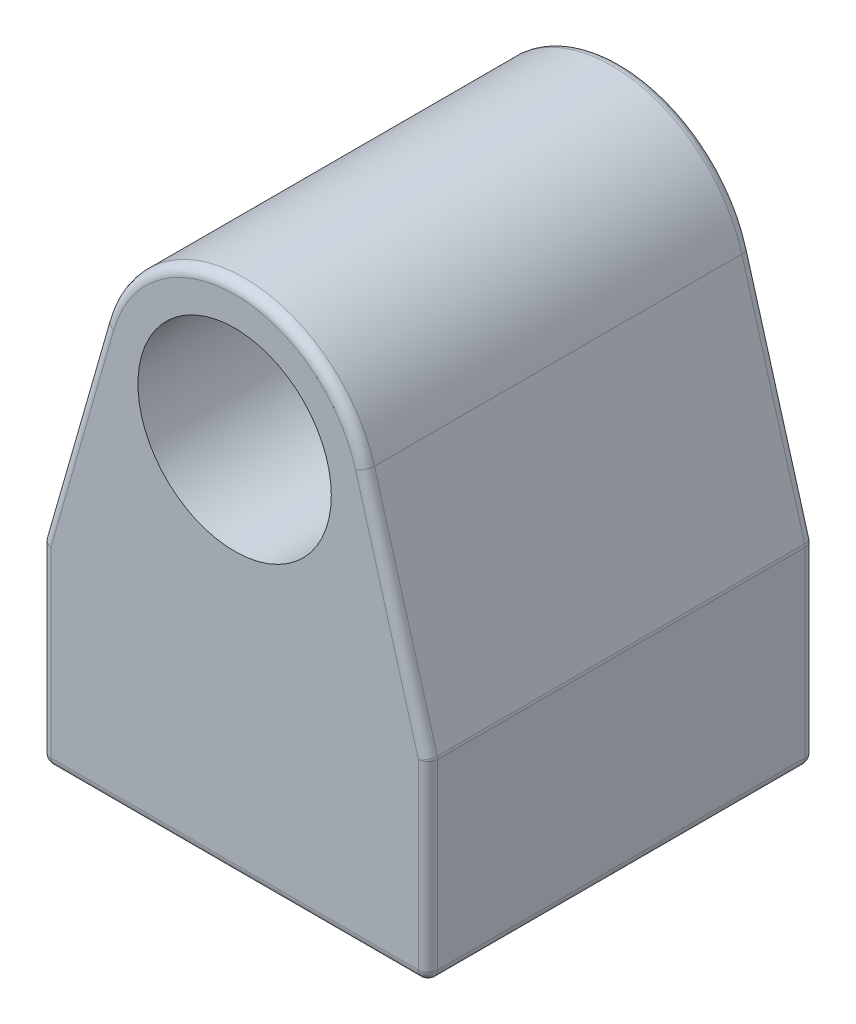
ISO-10303-21;
HEADER;
FILE_DESCRIPTION(('STEP AP214'),'2;1');
FILE_NAME('part.step','',(''),(''),'','','');
FILE_SCHEMA(('AUTOMOTIVE_DESIGN { 1 0 10303 214 1 1 1 1 }'));
ENDSEC;
DATA;
#1=APPLICATION_CONTEXT('core data for automotive mechanical design processes');
#2=APPLICATION_PROTOCOL_DEFINITION('international standard','automotive_design',2000,#1);
#3=PRODUCT_CONTEXT('',#1,'mechanical');
#4=PRODUCT('Part','Part','',(#3));
#5=PRODUCT_RELATED_PRODUCT_CATEGORY('part','',(#4));
#6=PRODUCT_DEFINITION_FORMATION('','',#4);
#7=PRODUCT_DEFINITION_CONTEXT('part definition',#1,'design');
#8=PRODUCT_DEFINITION('design','',#6,#7);
#9=PRODUCT_DEFINITION_SHAPE('','',#8);
#10=(LENGTH_UNIT() NAMED_UNIT(*) SI_UNIT(.MILLI.,.METRE.));
#11=(NAMED_UNIT(*) PLANE_ANGLE_UNIT() SI_UNIT($,.RADIAN.));
#12=(NAMED_UNIT(*) SI_UNIT($,.STERADIAN.) SOLID_ANGLE_UNIT());
#13=UNCERTAINTY_MEASURE_WITH_UNIT(LENGTH_MEASURE(1.E-05),#10,'distance_accuracy_value','');
#14=(GEOMETRIC_REPRESENTATION_CONTEXT(3) GLOBAL_UNCERTAINTY_ASSIGNED_CONTEXT((#13)) GLOBAL_UNIT_ASSIGNED_CONTEXT((#10,
#11,#12)) REPRESENTATION_CONTEXT('',''));
#15=CARTESIAN_POINT('',(0.,0.,0.));
#16=DIRECTION('',(0.,0.,1.));
#17=DIRECTION('',(1.,0.,0.));
#18=AXIS2_PLACEMENT_3D('',#15,#16,#17);
#19=CARTESIAN_POINT('',(0.,14.5,20.));
#20=DIRECTION('',(0.,0.,1.));
#21=DIRECTION('',(1.,0.,0.));
#22=AXIS2_PLACEMENT_3D('',#19,#20,#21);
#23=PLANE('',#22);
#24=DIRECTION('',(-0.275157126097487,0.961399269792614,0.));
#25=VECTOR('',#24,1.);
#26=CARTESIAN_POINT('',(6.24909525365199,16.2885213196337,20.));
#27=LINE('',#26,#25);
#28=CARTESIAN_POINT('',(9.49999999999999,4.92985693164692,20.));
#29=VERTEX_POINT('',#28);
#30=CARTESIAN_POINT('',(6.24909525365199,16.2885213196337,20.));
#31=VERTEX_POINT('',#30);
#32=EDGE_CURVE('E179',#29,#31,#27,.T.);
#33=ORIENTED_EDGE('',*,*,#32,.T.);
#34=CARTESIAN_POINT('',(0.,14.5,20.));
#35=DIRECTION('',(0.,0.,1.));
#36=DIRECTION('',(1.,0.,0.));
#37=AXIS2_PLACEMENT_3D('',#34,#35,#36);
#38=CIRCLE('',#37,6.5);
#39=CARTESIAN_POINT('',(-6.24909525365199,16.2885213196337,20.));
#40=VERTEX_POINT('',#39);
#41=EDGE_CURVE('E158',#31,#40,#38,.T.);
#42=ORIENTED_EDGE('',*,*,#41,.T.);
#43=DIRECTION('',(-0.27515712609749,-0.961399269792613,0.));
#44=VECTOR('',#43,1.);
#45=CARTESIAN_POINT('',(-9.5193003651037,4.86242143695125,20.));
#46=LINE('',#45,#44);
#47=CARTESIAN_POINT('',(-9.50000000000001,4.92985693164692,20.));
#48=VERTEX_POINT('',#47);
#49=EDGE_CURVE('E167',#40,#48,#46,.T.);
#50=ORIENTED_EDGE('',*,*,#49,.T.);
#51=DIRECTION('',(0.,-1.,0.));
#52=VECTOR('',#51,1.);
#53=CARTESIAN_POINT('',(-9.50000000000001,-5.00000000000001,20.));
#54=LINE('',#53,#52);
#55=CARTESIAN_POINT('',(-9.50000000000001,-4.5,20.));
#56=VERTEX_POINT('',#55);
#57=EDGE_CURVE('E174',#48,#56,#54,.T.);
#58=ORIENTED_EDGE('',*,*,#57,.T.);
#59=DIRECTION('',(1.,0.,0.));
#60=VECTOR('',#59,1.);
#61=CARTESIAN_POINT('',(9.99999999999999,-4.5,20.));
#62=LINE('',#61,#60);
#63=CARTESIAN_POINT('',(9.49999999999999,-4.5,20.));
#64=VERTEX_POINT('',#63);
#65=EDGE_CURVE('E388',#56,#64,#62,.T.);
#66=ORIENTED_EDGE('',*,*,#65,.T.);
#67=DIRECTION('',(0.,1.,0.));
#68=VECTOR('',#67,1.);
#69=CARTESIAN_POINT('',(9.49999999999999,5.,20.));
#70=LINE('',#69,#68);
#71=EDGE_CURVE('E187',#64,#29,#70,.T.);
#72=ORIENTED_EDGE('',*,*,#71,.T.);
#73=EDGE_LOOP('',(#33,#42,#50,#58,#66,#72));
#74=FACE_BOUND('',#73,.T.);
#75=CARTESIAN_POINT('',(0.,14.5,20.));
#76=DIRECTION('',(0.,0.,1.));
#77=DIRECTION('',(1.,0.,0.));
#78=AXIS2_PLACEMENT_3D('',#75,#76,#77);
#79=CIRCLE('',#78,5.);
#80=CARTESIAN_POINT('',(5.,14.5,20.));
#81=VERTEX_POINT('',#80);
#82=EDGE_CURVE('E372',#81,#81,#79,.T.);
#83=ORIENTED_EDGE('',*,*,#82,.F.);
#84=EDGE_LOOP('',(#83));
#85=FACE_BOUND('',#84,.T.);
#86=ADVANCED_FACE('F39',(#74,#85),#23,.T.);
#87=CARTESIAN_POINT('',(0.,14.5,0.));
#88=DIRECTION('',(0.,0.,1.));
#89=DIRECTION('',(1.,0.,0.));
#90=AXIS2_PLACEMENT_3D('',#87,#88,#89);
#91=PLANE('',#90);
#92=DIRECTION('',(-0.27515712609749,-0.961399269792613,0.));
#93=VECTOR('',#92,1.);
#94=CARTESIAN_POINT('',(-6.24909525365198,16.2885213196337,0.));
#95=LINE('',#94,#93);
#96=CARTESIAN_POINT('',(-9.50000000000001,4.92985693164692,0.));
#97=VERTEX_POINT('',#96);
#98=CARTESIAN_POINT('',(-6.24909525365199,16.2885213196337,0.));
#99=VERTEX_POINT('',#98);
#100=EDGE_CURVE('E193',#97,#99,#95,.F.);
#101=ORIENTED_EDGE('',*,*,#100,.T.);
#102=CARTESIAN_POINT('',(0.,14.5,0.));
#103=DIRECTION('',(0.,0.,1.));
#104=DIRECTION('',(1.,0.,0.));
#105=AXIS2_PLACEMENT_3D('',#102,#103,#104);
#106=CIRCLE('',#105,6.5);
#107=CARTESIAN_POINT('',(6.24909525365199,16.2885213196337,0.));
#108=VERTEX_POINT('',#107);
#109=EDGE_CURVE('E208',#99,#108,#106,.F.);
#110=ORIENTED_EDGE('',*,*,#109,.T.);
#111=DIRECTION('',(-0.275157126097487,0.961399269792614,0.));
#112=VECTOR('',#111,1.);
#113=CARTESIAN_POINT('',(6.24909525365199,16.2885213196337,0.));
#114=LINE('',#113,#112);
#115=CARTESIAN_POINT('',(9.49999999999999,4.92985693164692,0.));
#116=VERTEX_POINT('',#115);
#117=EDGE_CURVE('E205',#108,#116,#114,.F.);
#118=ORIENTED_EDGE('',*,*,#117,.T.);
#119=DIRECTION('',(0.,1.,0.));
#120=VECTOR('',#119,1.);
#121=CARTESIAN_POINT('',(9.49999999999999,14.5,0.));
#122=LINE('',#121,#120);
#123=CARTESIAN_POINT('',(9.49999999999999,-4.5,0.));
#124=VERTEX_POINT('',#123);
#125=EDGE_CURVE('E202',#116,#124,#122,.F.);
#126=ORIENTED_EDGE('',*,*,#125,.T.);
#127=DIRECTION('',(1.,0.,0.));
#128=VECTOR('',#127,1.);
#129=CARTESIAN_POINT('',(0.,-4.5,0.));
#130=LINE('',#129,#128);
#131=CARTESIAN_POINT('',(-9.50000000000001,-4.5,0.));
#132=VERTEX_POINT('',#131);
#133=EDGE_CURVE('E199',#124,#132,#130,.F.);
#134=ORIENTED_EDGE('',*,*,#133,.T.);
#135=DIRECTION('',(0.,-1.,0.));
#136=VECTOR('',#135,1.);
#137=CARTESIAN_POINT('',(-9.50000000000001,14.5,0.));
#138=LINE('',#137,#136);
#139=EDGE_CURVE('E196',#132,#97,#138,.F.);
#140=ORIENTED_EDGE('',*,*,#139,.T.);
#141=EDGE_LOOP('',(#101,#110,#118,#126,#134,#140));
#142=FACE_BOUND('',#141,.T.);
#143=CARTESIAN_POINT('',(0.,14.5,0.));
#144=DIRECTION('',(0.,0.,1.));
#145=DIRECTION('',(1.,0.,0.));
#146=AXIS2_PLACEMENT_3D('',#143,#144,#145);
#147=CIRCLE('',#146,5.);
#148=CARTESIAN_POINT('',(5.,14.5,0.));
#149=VERTEX_POINT('',#148);
#150=EDGE_CURVE('E365',#149,#149,#147,.T.);
#151=ORIENTED_EDGE('',*,*,#150,.T.);
#152=EDGE_LOOP('',(#151));
#153=FACE_BOUND('',#152,.T.);
#154=ADVANCED_FACE('F434',(#142,#153),#91,.F.);
#155=CARTESIAN_POINT('',(9.99999999999999,5.,20.));
#156=DIRECTION('',(-1.,0.,0.));
#157=DIRECTION('',(0.,0.,1.));
#158=AXIS2_PLACEMENT_3D('',#155,#156,#157);
#159=PLANE('',#158);
#160=DIRECTION('',(0.,0.,-1.));
#161=VECTOR('',#160,1.);
#162=CARTESIAN_POINT('',(9.99999999999999,4.92985693164692,20.));
#163=LINE('',#162,#161);
#164=CARTESIAN_POINT('',(9.99999999999999,4.92985693164692,0.5));
#165=VERTEX_POINT('',#164);
#166=CARTESIAN_POINT('',(9.99999999999999,4.92985693164692,19.5));
#167=VERTEX_POINT('',#166);
#168=EDGE_CURVE('E227',#165,#167,#163,.F.);
#169=ORIENTED_EDGE('',*,*,#168,.T.);
#170=DIRECTION('',(0.,1.,0.));
#171=VECTOR('',#170,1.);
#172=CARTESIAN_POINT('',(9.99999999999999,-5.,19.5));
#173=LINE('',#172,#171);
#174=CARTESIAN_POINT('',(9.99999999999999,-4.5,19.5));
#175=VERTEX_POINT('',#174);
#176=EDGE_CURVE('E230',#167,#175,#173,.F.);
#177=ORIENTED_EDGE('',*,*,#176,.T.);
#178=DIRECTION('',(0.,0.,-1.));
#179=VECTOR('',#178,1.);
#180=CARTESIAN_POINT('',(9.99999999999999,-4.5,20.));
#181=LINE('',#180,#179);
#182=CARTESIAN_POINT('',(9.99999999999999,-4.5,0.5));
#183=VERTEX_POINT('',#182);
#184=EDGE_CURVE('E221',#175,#183,#181,.T.);
#185=ORIENTED_EDGE('',*,*,#184,.T.);
#186=DIRECTION('',(0.,1.,0.));
#187=VECTOR('',#186,1.);
#188=CARTESIAN_POINT('',(9.99999999999999,5.,0.5));
#189=LINE('',#188,#187);
#190=EDGE_CURVE('E224',#183,#165,#189,.T.);
#191=ORIENTED_EDGE('',*,*,#190,.T.);
#192=EDGE_LOOP('',(#169,#177,#185,#191));
#193=FACE_BOUND('',#192,.T.);
#194=ADVANCED_FACE('F426',(#193),#159,.F.);
#195=CARTESIAN_POINT('',(6.7297948885483,16.4260998826824,20.));
#196=DIRECTION('',(-0.961399269792614,-0.275157126097487,0.));
#197=DIRECTION('',(0.275157126097487,-0.961399269792614,0.));
#198=AXIS2_PLACEMENT_3D('',#195,#196,#197);
#199=PLANE('',#198);
#200=DIRECTION('',(0.,0.,-1.));
#201=VECTOR('',#200,1.);
#202=CARTESIAN_POINT('',(6.7297948885483,16.4260998826824,20.));
#203=LINE('',#202,#201);
#204=CARTESIAN_POINT('',(6.7297948885483,16.4260998826824,19.5));
#205=VERTEX_POINT('',#204);
#206=CARTESIAN_POINT('',(6.7297948885483,16.4260998826824,0.5));
#207=VERTEX_POINT('',#206);
#208=EDGE_CURVE('E175',#205,#207,#203,.T.);
#209=ORIENTED_EDGE('',*,*,#208,.F.);
#210=DIRECTION('',(-0.275157126097487,0.961399269792614,0.));
#211=VECTOR('',#210,1.);
#212=CARTESIAN_POINT('',(9.99999999999999,5.,19.5));
#213=LINE('',#212,#211);
#214=CARTESIAN_POINT('',(9.9806996348963,5.06743549469566,19.5));
#215=VERTEX_POINT('',#214);
#216=EDGE_CURVE('E218',#205,#215,#213,.F.);
#217=ORIENTED_EDGE('',*,*,#216,.T.);
#218=DIRECTION('',(0.,0.,-1.));
#219=VECTOR('',#218,1.);
#220=CARTESIAN_POINT('',(9.9806996348963,5.06743549469566,20.));
#221=LINE('',#220,#219);
#222=CARTESIAN_POINT('',(9.9806996348963,5.06743549469566,0.5));
#223=VERTEX_POINT('',#222);
#224=EDGE_CURVE('E212',#215,#223,#221,.T.);
#225=ORIENTED_EDGE('',*,*,#224,.T.);
#226=DIRECTION('',(-0.275157126097487,0.961399269792614,0.));
#227=VECTOR('',#226,1.);
#228=CARTESIAN_POINT('',(6.7297948885483,16.4260998826824,0.5));
#229=LINE('',#228,#227);
#230=EDGE_CURVE('E215',#223,#207,#229,.T.);
#231=ORIENTED_EDGE('',*,*,#230,.T.);
#232=EDGE_LOOP('',(#209,#217,#225,#231));
#233=FACE_BOUND('',#232,.T.);
#234=ADVANCED_FACE('F412',(#233),#199,.F.);
#235=CARTESIAN_POINT('',(0.,14.5,20.));
#236=DIRECTION('',(0.,0.,-1.));
#237=DIRECTION('',(-1.,0.,0.));
#238=AXIS2_PLACEMENT_3D('',#235,#236,#237);
#239=CYLINDRICAL_SURFACE('',#238,7.);
#240=DIRECTION('',(0.,0.,-1.));
#241=VECTOR('',#240,1.);
#242=CARTESIAN_POINT('',(-6.72979488854829,16.4260998826824,20.));
#243=LINE('',#242,#241);
#244=CARTESIAN_POINT('',(-6.72979488854829,16.4260998826824,19.5));
#245=VERTEX_POINT('',#244);
#246=CARTESIAN_POINT('',(-6.72979488854829,16.4260998826824,0.5));
#247=VERTEX_POINT('',#246);
#248=EDGE_CURVE('E378',#245,#247,#243,.T.);
#249=ORIENTED_EDGE('',*,*,#248,.F.);
#250=CARTESIAN_POINT('',(0.,14.5,19.5));
#251=DIRECTION('',(0.,0.,1.));
#252=DIRECTION('',(1.,0.,0.));
#253=AXIS2_PLACEMENT_3D('',#250,#251,#252);
#254=CIRCLE('',#253,7.);
#255=EDGE_CURVE('E160',#245,#205,#254,.F.);
#256=ORIENTED_EDGE('',*,*,#255,.T.);
#257=ORIENTED_EDGE('',*,*,#208,.T.);
#258=CARTESIAN_POINT('',(0.,14.5,0.5));
#259=DIRECTION('',(0.,0.,1.));
#260=DIRECTION('',(1.,0.,0.));
#261=AXIS2_PLACEMENT_3D('',#258,#259,#260);
#262=CIRCLE('',#261,7.);
#263=EDGE_CURVE('E182',#207,#247,#262,.T.);
#264=ORIENTED_EDGE('',*,*,#263,.T.);
#265=EDGE_LOOP('',(#249,#256,#257,#264));
#266=FACE_BOUND('',#265,.T.);
#267=ADVANCED_FACE('F410',(#266),#239,.T.);
#268=CARTESIAN_POINT('',(-10.,5.,20.));
#269=DIRECTION('',(0.961399269792613,-0.27515712609749,0.));
#270=DIRECTION('',(0.27515712609749,0.961399269792613,0.));
#271=AXIS2_PLACEMENT_3D('',#268,#269,#270);
#272=PLANE('',#271);
#273=DIRECTION('',(0.,0.,-1.));
#274=VECTOR('',#273,1.);
#275=CARTESIAN_POINT('',(-9.98069963489632,5.06743549469566,20.));
#276=LINE('',#275,#274);
#277=CARTESIAN_POINT('',(-9.98069963489632,5.06743549469566,0.5));
#278=VERTEX_POINT('',#277);
#279=CARTESIAN_POINT('',(-9.98069963489632,5.06743549469566,19.5));
#280=VERTEX_POINT('',#279);
#281=EDGE_CURVE('E49',#278,#280,#276,.F.);
#282=ORIENTED_EDGE('',*,*,#281,.T.);
#283=DIRECTION('',(-0.27515712609749,-0.961399269792613,0.));
#284=VECTOR('',#283,1.);
#285=CARTESIAN_POINT('',(-6.72979488854829,16.4260998826824,19.5));
#286=LINE('',#285,#284);
#287=EDGE_CURVE('E11',#280,#245,#286,.F.);
#288=ORIENTED_EDGE('',*,*,#287,.T.);
#289=ORIENTED_EDGE('',*,*,#248,.T.);
#290=DIRECTION('',(-0.27515712609749,-0.961399269792613,0.));
#291=VECTOR('',#290,1.);
#292=CARTESIAN_POINT('',(-10.,5.,0.5));
#293=LINE('',#292,#291);
#294=EDGE_CURVE('E60',#247,#278,#293,.T.);
#295=ORIENTED_EDGE('',*,*,#294,.T.);
#296=EDGE_LOOP('',(#282,#288,#289,#295));
#297=FACE_BOUND('',#296,.T.);
#298=ADVANCED_FACE('F452',(#297),#272,.F.);
#299=CARTESIAN_POINT('',(-10.,5.,20.));
#300=DIRECTION('',(1.,0.,0.));
#301=DIRECTION('',(0.,1.,0.));
#302=AXIS2_PLACEMENT_3D('',#299,#300,#301);
#303=PLANE('',#302);
#304=DIRECTION('',(0.,0.,-1.));
#305=VECTOR('',#304,1.);
#306=CARTESIAN_POINT('',(-10.,-4.5,20.));
#307=LINE('',#306,#305);
#308=CARTESIAN_POINT('',(-10.,-4.5,0.5));
#309=VERTEX_POINT('',#308);
#310=CARTESIAN_POINT('',(-10.,-4.5,19.5));
#311=VERTEX_POINT('',#310);
#312=EDGE_CURVE('E253',#309,#311,#307,.F.);
#313=ORIENTED_EDGE('',*,*,#312,.T.);
#314=DIRECTION('',(0.,-1.,0.));
#315=VECTOR('',#314,1.);
#316=CARTESIAN_POINT('',(-10.,5.,19.5));
#317=LINE('',#316,#315);
#318=CARTESIAN_POINT('',(-10.,4.92985693164692,19.5));
#319=VERTEX_POINT('',#318);
#320=EDGE_CURVE('E256',#311,#319,#317,.F.);
#321=ORIENTED_EDGE('',*,*,#320,.T.);
#322=DIRECTION('',(0.,0.,-1.));
#323=VECTOR('',#322,1.);
#324=CARTESIAN_POINT('',(-10.,4.92985693164692,20.));
#325=LINE('',#324,#323);
#326=CARTESIAN_POINT('',(-10.,4.92985693164692,0.5));
#327=VERTEX_POINT('',#326);
#328=EDGE_CURVE('E247',#319,#327,#325,.T.);
#329=ORIENTED_EDGE('',*,*,#328,.T.);
#330=DIRECTION('',(0.,-1.,0.));
#331=VECTOR('',#330,1.);
#332=CARTESIAN_POINT('',(-10.,5.,0.5));
#333=LINE('',#332,#331);
#334=EDGE_CURVE('E250',#327,#309,#333,.T.);
#335=ORIENTED_EDGE('',*,*,#334,.T.);
#336=EDGE_LOOP('',(#313,#321,#329,#335));
#337=FACE_BOUND('',#336,.T.);
#338=ADVANCED_FACE('F454',(#337),#303,.F.);
#339=CARTESIAN_POINT('',(-10.,-5.,20.));
#340=DIRECTION('',(0.,1.,0.));
#341=DIRECTION('',(0.,0.,1.));
#342=AXIS2_PLACEMENT_3D('',#339,#340,#341);
#343=PLANE('',#342);
#344=DIRECTION('',(0.,0.,-1.));
#345=VECTOR('',#344,1.);
#346=CARTESIAN_POINT('',(9.49999999999999,-5.,20.));
#347=LINE('',#346,#345);
#348=CARTESIAN_POINT('',(9.49999999999999,-5.,0.5));
#349=VERTEX_POINT('',#348);
#350=CARTESIAN_POINT('',(9.49999999999999,-5.,19.5));
#351=VERTEX_POINT('',#350);
#352=EDGE_CURVE('E240',#349,#351,#347,.F.);
#353=ORIENTED_EDGE('',*,*,#352,.T.);
#354=DIRECTION('',(1.,0.,0.));
#355=VECTOR('',#354,1.);
#356=CARTESIAN_POINT('',(-10.,-5.,19.5));
#357=LINE('',#356,#355);
#358=CARTESIAN_POINT('',(-9.50000000000001,-5.,19.5));
#359=VERTEX_POINT('',#358);
#360=EDGE_CURVE('E243',#351,#359,#357,.F.);
#361=ORIENTED_EDGE('',*,*,#360,.T.);
#362=DIRECTION('',(0.,0.,-1.));
#363=VECTOR('',#362,1.);
#364=CARTESIAN_POINT('',(-9.50000000000001,-5.,20.));
#365=LINE('',#364,#363);
#366=CARTESIAN_POINT('',(-9.50000000000001,-5.,0.5));
#367=VERTEX_POINT('',#366);
#368=EDGE_CURVE('E234',#359,#367,#365,.T.);
#369=ORIENTED_EDGE('',*,*,#368,.T.);
#370=DIRECTION('',(1.,0.,0.));
#371=VECTOR('',#370,1.);
#372=CARTESIAN_POINT('',(-10.,-5.,0.5));
#373=LINE('',#372,#371);
#374=EDGE_CURVE('E237',#367,#349,#373,.T.);
#375=ORIENTED_EDGE('',*,*,#374,.T.);
#376=EDGE_LOOP('',(#353,#361,#369,#375));
#377=FACE_BOUND('',#376,.T.);
#378=ADVANCED_FACE('F460',(#377),#343,.F.);
#379=CARTESIAN_POINT('',(0.,14.5,20.));
#380=DIRECTION('',(0.,0.,-1.));
#381=DIRECTION('',(-1.,0.,0.));
#382=AXIS2_PLACEMENT_3D('',#379,#380,#381);
#383=CYLINDRICAL_SURFACE('',#382,5.);
#384=ORIENTED_EDGE('',*,*,#82,.T.);
#385=EDGE_LOOP('',(#384));
#386=FACE_BOUND('',#385,.T.);
#387=ORIENTED_EDGE('',*,*,#150,.F.);
#388=EDGE_LOOP('',(#387));
#389=FACE_BOUND('',#388,.T.);
#390=ADVANCED_FACE('F471',(#386,#389),#383,.F.);
#391=CARTESIAN_POINT('',(-10.,-4.5,0.5));
#392=DIRECTION('',(1.,0.,0.));
#393=DIRECTION('',(0.,0.,-1.));
#394=AXIS2_PLACEMENT_3D('',#391,#392,#393);
#395=CYLINDRICAL_SURFACE('',#394,0.5);
#396=CARTESIAN_POINT('',(9.49999999999999,-4.5,0.5));
#397=DIRECTION('',(1.,0.,0.));
#398=DIRECTION('',(0.,0.,-1.));
#399=AXIS2_PLACEMENT_3D('',#396,#397,#398);
#400=CIRCLE('',#399,0.5);
#401=EDGE_CURVE('E43',#349,#124,#400,.T.);
#402=ORIENTED_EDGE('',*,*,#401,.F.);
#403=ORIENTED_EDGE('',*,*,#374,.F.);
#404=CARTESIAN_POINT('',(-9.50000000000001,-4.5,0.5));
#405=DIRECTION('',(-1.,0.,0.));
#406=DIRECTION('',(0.,0.,1.));
#407=AXIS2_PLACEMENT_3D('',#404,#405,#406);
#408=CIRCLE('',#407,0.5);
#409=EDGE_CURVE('E356',#132,#367,#408,.T.);
#410=ORIENTED_EDGE('',*,*,#409,.F.);
#411=ORIENTED_EDGE('',*,*,#133,.F.);
#412=EDGE_LOOP('',(#402,#403,#410,#411));
#413=FACE_BOUND('',#412,.T.);
#414=ADVANCED_FACE('F41',(#413),#395,.T.);
#415=CARTESIAN_POINT('',(9.49999999999999,-4.5,0.5));
#416=DIRECTION('',(0.,0.,-1.));
#417=DIRECTION('',(-1.,0.,0.));
#418=AXIS2_PLACEMENT_3D('',#415,#416,#417);
#419=SPHERICAL_SURFACE('',#418,0.5);
#420=CARTESIAN_POINT('',(9.49999999999999,-4.5,0.5));
#421=DIRECTION('',(0.,0.,-1.));
#422=DIRECTION('',(-1.,0.,0.));
#423=AXIS2_PLACEMENT_3D('',#420,#421,#422);
#424=CIRCLE('',#423,0.5);
#425=EDGE_CURVE('E345',#349,#183,#424,.F.);
#426=ORIENTED_EDGE('',*,*,#425,.F.);
#427=ORIENTED_EDGE('',*,*,#401,.T.);
#428=CARTESIAN_POINT('',(9.49999999999999,-4.5,0.5));
#429=DIRECTION('',(0.,-1.,0.));
#430=DIRECTION('',(0.,0.,-1.));
#431=AXIS2_PLACEMENT_3D('',#428,#429,#430);
#432=CIRCLE('',#431,0.5);
#433=EDGE_CURVE('E349',#183,#124,#432,.F.);
#434=ORIENTED_EDGE('',*,*,#433,.F.);
#435=EDGE_LOOP('',(#426,#427,#434));
#436=FACE_BOUND('',#435,.T.);
#437=ADVANCED_FACE('F523',(#436),#419,.T.);
#438=CARTESIAN_POINT('',(-9.50000000000001,-4.5,0.5));
#439=DIRECTION('',(0.,-1.,0.));
#440=DIRECTION('',(0.,0.,-1.));
#441=AXIS2_PLACEMENT_3D('',#438,#439,#440);
#442=SPHERICAL_SURFACE('',#441,0.5);
#443=CARTESIAN_POINT('',(-9.50000000000001,-4.5,0.5));
#444=DIRECTION('',(0.,-1.,0.));
#445=DIRECTION('',(0.,0.,-1.));
#446=AXIS2_PLACEMENT_3D('',#443,#444,#445);
#447=CIRCLE('',#446,0.5);
#448=EDGE_CURVE('E337',#132,#309,#447,.F.);
#449=ORIENTED_EDGE('',*,*,#448,.F.);
#450=ORIENTED_EDGE('',*,*,#409,.T.);
#451=CARTESIAN_POINT('',(-9.50000000000001,-4.5,0.5));
#452=DIRECTION('',(0.,0.,-1.));
#453=DIRECTION('',(-1.,0.,0.));
#454=AXIS2_PLACEMENT_3D('',#451,#452,#453);
#455=CIRCLE('',#454,0.5);
#456=EDGE_CURVE('E341',#309,#367,#455,.F.);
#457=ORIENTED_EDGE('',*,*,#456,.F.);
#458=EDGE_LOOP('',(#449,#450,#457));
#459=FACE_BOUND('',#458,.T.);
#460=ADVANCED_FACE('F438',(#459),#442,.T.);
#461=CARTESIAN_POINT('',(0.,14.5,0.5));
#462=DIRECTION('',(0.,0.,1.));
#463=DIRECTION('',(1.,0.,0.));
#464=AXIS2_PLACEMENT_3D('',#461,#462,#463);
#465=TOROIDAL_SURFACE('',#464,6.5,0.5);
#466=CARTESIAN_POINT('',(-6.24909525365199,16.2885213196337,0.5));
#467=DIRECTION('',(-0.275157126097491,-0.961399269792613,0.));
#468=DIRECTION('',(0.961399269792613,-0.275157126097491,0.));
#469=AXIS2_PLACEMENT_3D('',#466,#467,#468);
#470=CIRCLE('',#469,0.5);
#471=EDGE_CURVE('E333',#247,#99,#470,.T.);
#472=ORIENTED_EDGE('',*,*,#471,.F.);
#473=ORIENTED_EDGE('',*,*,#263,.F.);
#474=CARTESIAN_POINT('',(6.24909525365199,16.2885213196337,0.5));
#475=DIRECTION('',(0.275157126097485,-0.961399269792615,0.));
#476=DIRECTION('',(0.961399269792615,0.275157126097485,0.));
#477=AXIS2_PLACEMENT_3D('',#474,#475,#476);
#478=CIRCLE('',#477,0.5);
#479=EDGE_CURVE('E353',#108,#207,#478,.T.);
#480=ORIENTED_EDGE('',*,*,#479,.F.);
#481=ORIENTED_EDGE('',*,*,#109,.F.);
#482=EDGE_LOOP('',(#472,#473,#480,#481));
#483=FACE_BOUND('',#482,.T.);
#484=ADVANCED_FACE('F451',(#483),#465,.T.);
#485=CARTESIAN_POINT('',(6.24909525365199,16.2885213196337,0.5));
#486=DIRECTION('',(-0.275157126097487,0.961399269792614,0.));
#487=DIRECTION('',(-0.961399269792614,-0.275157126097487,0.));
#488=AXIS2_PLACEMENT_3D('',#485,#486,#487);
#489=CYLINDRICAL_SURFACE('',#488,0.5);
#490=ORIENTED_EDGE('',*,*,#479,.T.);
#491=ORIENTED_EDGE('',*,*,#230,.F.);
#492=CARTESIAN_POINT('',(9.49999999999999,4.92985693164692,0.5));
#493=DIRECTION('',(0.275157126097485,-0.961399269792615,0.));
#494=DIRECTION('',(0.961399269792615,0.275157126097485,0.));
#495=AXIS2_PLACEMENT_3D('',#492,#493,#494);
#496=CIRCLE('',#495,0.5);
#497=EDGE_CURVE('E329',#116,#223,#496,.T.);
#498=ORIENTED_EDGE('',*,*,#497,.F.);
#499=ORIENTED_EDGE('',*,*,#117,.F.);
#500=EDGE_LOOP('',(#490,#491,#498,#499));
#501=FACE_BOUND('',#500,.T.);
#502=ADVANCED_FACE('F416',(#501),#489,.T.);
#503=CARTESIAN_POINT('',(9.49999999999999,5.,0.5));
#504=DIRECTION('',(0.,1.,0.));
#505=DIRECTION('',(0.,0.,1.));
#506=AXIS2_PLACEMENT_3D('',#503,#504,#505);
#507=CYLINDRICAL_SURFACE('',#506,0.5);
#508=ORIENTED_EDGE('',*,*,#433,.T.);
#509=ORIENTED_EDGE('',*,*,#125,.F.);
#510=CARTESIAN_POINT('',(9.49999999999999,4.92985693164692,0.5));
#511=DIRECTION('',(0.,1.,0.));
#512=DIRECTION('',(0.,0.,1.));
#513=AXIS2_PLACEMENT_3D('',#510,#511,#512);
#514=CIRCLE('',#513,0.5);
#515=EDGE_CURVE('E325',#165,#116,#514,.T.);
#516=ORIENTED_EDGE('',*,*,#515,.F.);
#517=ORIENTED_EDGE('',*,*,#190,.F.);
#518=EDGE_LOOP('',(#508,#509,#516,#517));
#519=FACE_BOUND('',#518,.T.);
#520=ADVANCED_FACE('F431',(#519),#507,.T.);
#521=CARTESIAN_POINT('',(9.49999999999999,-4.5,20.));
#522=DIRECTION('',(0.,0.,-1.));
#523=DIRECTION('',(-1.,0.,0.));
#524=AXIS2_PLACEMENT_3D('',#521,#522,#523);
#525=CYLINDRICAL_SURFACE('',#524,0.5);
#526=ORIENTED_EDGE('',*,*,#425,.T.);
#527=ORIENTED_EDGE('',*,*,#184,.F.);
#528=CARTESIAN_POINT('',(9.49999999999999,-4.5,19.5));
#529=DIRECTION('',(0.,0.,1.));
#530=DIRECTION('',(1.,0.,0.));
#531=AXIS2_PLACEMENT_3D('',#528,#529,#530);
#532=CIRCLE('',#531,0.5);
#533=EDGE_CURVE('E321',#351,#175,#532,.T.);
#534=ORIENTED_EDGE('',*,*,#533,.F.);
#535=ORIENTED_EDGE('',*,*,#352,.F.);
#536=EDGE_LOOP('',(#526,#527,#534,#535));
#537=FACE_BOUND('',#536,.T.);
#538=ADVANCED_FACE('F488',(#537),#525,.T.);
#539=CARTESIAN_POINT('',(0.,-4.5,19.5));
#540=DIRECTION('',(-1.,0.,0.));
#541=DIRECTION('',(0.,0.,1.));
#542=AXIS2_PLACEMENT_3D('',#539,#540,#541);
#543=CYLINDRICAL_SURFACE('',#542,0.5);
#544=CARTESIAN_POINT('',(-9.50000000000001,-4.5,19.5));
#545=DIRECTION('',(-1.,0.,0.));
#546=DIRECTION('',(0.,0.,1.));
#547=AXIS2_PLACEMENT_3D('',#544,#545,#546);
#548=CIRCLE('',#547,0.5);
#549=EDGE_CURVE('E313',#359,#56,#548,.T.);
#550=ORIENTED_EDGE('',*,*,#549,.F.);
#551=ORIENTED_EDGE('',*,*,#360,.F.);
#552=CARTESIAN_POINT('',(9.49999999999999,-4.5,19.5));
#553=DIRECTION('',(1.,0.,0.));
#554=DIRECTION('',(0.,0.,-1.));
#555=AXIS2_PLACEMENT_3D('',#552,#553,#554);
#556=CIRCLE('',#555,0.5);
#557=EDGE_CURVE('E317',#64,#351,#556,.T.);
#558=ORIENTED_EDGE('',*,*,#557,.F.);
#559=ORIENTED_EDGE('',*,*,#65,.F.);
#560=EDGE_LOOP('',(#550,#551,#558,#559));
#561=FACE_BOUND('',#560,.T.);
#562=ADVANCED_FACE('F485',(#561),#543,.T.);
#563=CARTESIAN_POINT('',(-9.50000000000001,-4.5,20.));
#564=DIRECTION('',(0.,0.,-1.));
#565=DIRECTION('',(-1.,0.,0.));
#566=AXIS2_PLACEMENT_3D('',#563,#564,#565);
#567=CYLINDRICAL_SURFACE('',#566,0.5);
#568=ORIENTED_EDGE('',*,*,#456,.T.);
#569=ORIENTED_EDGE('',*,*,#368,.F.);
#570=CARTESIAN_POINT('',(-9.50000000000001,-4.5,19.5));
#571=DIRECTION('',(0.,0.,1.));
#572=DIRECTION('',(1.,0.,0.));
#573=AXIS2_PLACEMENT_3D('',#570,#571,#572);
#574=CIRCLE('',#573,0.5);
#575=EDGE_CURVE('E310',#311,#359,#574,.T.);
#576=ORIENTED_EDGE('',*,*,#575,.F.);
#577=ORIENTED_EDGE('',*,*,#312,.F.);
#578=EDGE_LOOP('',(#568,#569,#576,#577));
#579=FACE_BOUND('',#578,.T.);
#580=ADVANCED_FACE('F508',(#579),#567,.T.);
#581=CARTESIAN_POINT('',(-9.50000000000001,5.,0.5));
#582=DIRECTION('',(0.,-1.,0.));
#583=DIRECTION('',(1.,0.,0.));
#584=AXIS2_PLACEMENT_3D('',#581,#582,#583);
#585=CYLINDRICAL_SURFACE('',#584,0.5);
#586=ORIENTED_EDGE('',*,*,#448,.T.);
#587=ORIENTED_EDGE('',*,*,#334,.F.);
#588=CARTESIAN_POINT('',(-9.50000000000001,4.92985693164692,0.5));
#589=DIRECTION('',(0.,1.,0.));
#590=DIRECTION('',(-1.,0.,0.));
#591=AXIS2_PLACEMENT_3D('',#588,#589,#590);
#592=CIRCLE('',#591,0.5);
#593=EDGE_CURVE('E306',#97,#327,#592,.T.);
#594=ORIENTED_EDGE('',*,*,#593,.F.);
#595=ORIENTED_EDGE('',*,*,#139,.F.);
#596=EDGE_LOOP('',(#586,#587,#594,#595));
#597=FACE_BOUND('',#596,.T.);
#598=ADVANCED_FACE('F443',(#597),#585,.T.);
#599=CARTESIAN_POINT('',(-9.5193003651037,4.86242143695125,0.5));
#600=DIRECTION('',(-0.27515712609749,-0.961399269792613,0.));
#601=DIRECTION('',(0.961399269792613,-0.27515712609749,0.));
#602=AXIS2_PLACEMENT_3D('',#599,#600,#601);
#603=CYLINDRICAL_SURFACE('',#602,0.5);
#604=ORIENTED_EDGE('',*,*,#471,.T.);
#605=ORIENTED_EDGE('',*,*,#100,.F.);
#606=CARTESIAN_POINT('',(-9.50000000000001,4.92985693164692,0.5));
#607=DIRECTION('',(-0.27515712609749,-0.961399269792613,0.));
#608=DIRECTION('',(0.961399269792613,-0.27515712609749,0.));
#609=AXIS2_PLACEMENT_3D('',#606,#607,#608);
#610=CIRCLE('',#609,0.5);
#611=EDGE_CURVE('E302',#278,#97,#610,.T.);
#612=ORIENTED_EDGE('',*,*,#611,.F.);
#613=ORIENTED_EDGE('',*,*,#294,.F.);
#614=EDGE_LOOP('',(#604,#605,#612,#613));
#615=FACE_BOUND('',#614,.T.);
#616=ADVANCED_FACE('F447',(#615),#603,.T.);
#617=CARTESIAN_POINT('',(9.49999999999999,4.92985693164692,0.5));
#618=DIRECTION('',(0.,0.,-1.));
#619=DIRECTION('',(0.,1.,0.));
#620=AXIS2_PLACEMENT_3D('',#617,#618,#619);
#621=SPHERICAL_SURFACE('',#620,0.5);
#622=ORIENTED_EDGE('',*,*,#515,.T.);
#623=ORIENTED_EDGE('',*,*,#497,.T.);
#624=CARTESIAN_POINT('',(9.49999999999999,4.92985693164692,0.5));
#625=DIRECTION('',(0.,0.,-1.));
#626=DIRECTION('',(-1.,0.,0.));
#627=AXIS2_PLACEMENT_3D('',#624,#625,#626);
#628=CIRCLE('',#627,0.5);
#629=EDGE_CURVE('E298',#165,#223,#628,.F.);
#630=ORIENTED_EDGE('',*,*,#629,.F.);
#631=EDGE_LOOP('',(#622,#623,#630));
#632=FACE_BOUND('',#631,.T.);
#633=ADVANCED_FACE('F420',(#632),#621,.T.);
#634=CARTESIAN_POINT('',(9.49999999999999,-4.5,19.5));
#635=DIRECTION('',(0.,-1.,0.));
#636=DIRECTION('',(0.,0.,-1.));
#637=AXIS2_PLACEMENT_3D('',#634,#635,#636);
#638=SPHERICAL_SURFACE('',#637,0.5);
#639=ORIENTED_EDGE('',*,*,#557,.T.);
#640=ORIENTED_EDGE('',*,*,#533,.T.);
#641=CARTESIAN_POINT('',(9.49999999999999,-4.5,19.5));
#642=DIRECTION('',(0.,-1.,0.));
#643=DIRECTION('',(0.,0.,-1.));
#644=AXIS2_PLACEMENT_3D('',#641,#642,#643);
#645=CIRCLE('',#644,0.5);
#646=EDGE_CURVE('E295',#64,#175,#645,.F.);
#647=ORIENTED_EDGE('',*,*,#646,.F.);
#648=EDGE_LOOP('',(#639,#640,#647));
#649=FACE_BOUND('',#648,.T.);
#650=ADVANCED_FACE('F490',(#649),#638,.T.);
#651=CARTESIAN_POINT('',(-9.50000000000001,-4.5,19.5));
#652=DIRECTION('',(0.,-1.,0.));
#653=DIRECTION('',(0.,0.,-1.));
#654=AXIS2_PLACEMENT_3D('',#651,#652,#653);
#655=SPHERICAL_SURFACE('',#654,0.5);
#656=ORIENTED_EDGE('',*,*,#575,.T.);
#657=ORIENTED_EDGE('',*,*,#549,.T.);
#658=CARTESIAN_POINT('',(-9.50000000000001,-4.5,19.5));
#659=DIRECTION('',(0.,-1.,0.));
#660=DIRECTION('',(0.,0.,-1.));
#661=AXIS2_PLACEMENT_3D('',#658,#659,#660);
#662=CIRCLE('',#661,0.5);
#663=EDGE_CURVE('E291',#311,#56,#662,.F.);
#664=ORIENTED_EDGE('',*,*,#663,.F.);
#665=EDGE_LOOP('',(#656,#657,#664));
#666=FACE_BOUND('',#665,.T.);
#667=ADVANCED_FACE('F492',(#666),#655,.T.);
#668=CARTESIAN_POINT('',(-9.50000000000001,4.92985693164692,0.5));
#669=DIRECTION('',(0.,0.,-1.));
#670=DIRECTION('',(0.,1.,0.));
#671=AXIS2_PLACEMENT_3D('',#668,#669,#670);
#672=SPHERICAL_SURFACE('',#671,0.5);
#673=ORIENTED_EDGE('',*,*,#611,.T.);
#674=ORIENTED_EDGE('',*,*,#593,.T.);
#675=CARTESIAN_POINT('',(-9.50000000000001,4.92985693164692,0.5));
#676=DIRECTION('',(0.,0.,-1.));
#677=DIRECTION('',(-1.,0.,0.));
#678=AXIS2_PLACEMENT_3D('',#675,#676,#677);
#679=CIRCLE('',#678,0.5);
#680=EDGE_CURVE('E287',#278,#327,#679,.F.);
#681=ORIENTED_EDGE('',*,*,#680,.F.);
#682=EDGE_LOOP('',(#673,#674,#681));
#683=FACE_BOUND('',#682,.T.);
#684=ADVANCED_FACE('F498',(#683),#672,.T.);
#685=CARTESIAN_POINT('',(9.49999999999999,4.92985693164692,20.));
#686=DIRECTION('',(0.,0.,-1.));
#687=DIRECTION('',(-1.,0.,0.));
#688=AXIS2_PLACEMENT_3D('',#685,#686,#687);
#689=CYLINDRICAL_SURFACE('',#688,0.5);
#690=ORIENTED_EDGE('',*,*,#629,.T.);
#691=ORIENTED_EDGE('',*,*,#224,.F.);
#692=CARTESIAN_POINT('',(9.49999999999999,4.92985693164692,19.5));
#693=DIRECTION('',(0.,0.,1.));
#694=DIRECTION('',(1.,0.,0.));
#695=AXIS2_PLACEMENT_3D('',#692,#693,#694);
#696=CIRCLE('',#695,0.5);
#697=EDGE_CURVE('E283',#167,#215,#696,.T.);
#698=ORIENTED_EDGE('',*,*,#697,.F.);
#699=ORIENTED_EDGE('',*,*,#168,.F.);
#700=EDGE_LOOP('',(#690,#691,#698,#699));
#701=FACE_BOUND('',#700,.T.);
#702=ADVANCED_FACE('F424',(#701),#689,.T.);
#703=CARTESIAN_POINT('',(9.49999999999999,14.5,19.5));
#704=DIRECTION('',(0.,-1.,0.));
#705=DIRECTION('',(0.,0.,-1.));
#706=AXIS2_PLACEMENT_3D('',#703,#704,#705);
#707=CYLINDRICAL_SURFACE('',#706,0.5);
#708=ORIENTED_EDGE('',*,*,#646,.T.);
#709=ORIENTED_EDGE('',*,*,#176,.F.);
#710=CARTESIAN_POINT('',(9.49999999999999,4.92985693164692,19.5));
#711=DIRECTION('',(0.,1.,0.));
#712=DIRECTION('',(-1.,0.,0.));
#713=AXIS2_PLACEMENT_3D('',#710,#711,#712);
#714=CIRCLE('',#713,0.5);
#715=EDGE_CURVE('E279',#29,#167,#714,.T.);
#716=ORIENTED_EDGE('',*,*,#715,.F.);
#717=ORIENTED_EDGE('',*,*,#71,.F.);
#718=EDGE_LOOP('',(#708,#709,#716,#717));
#719=FACE_BOUND('',#718,.T.);
#720=ADVANCED_FACE('F398',(#719),#707,.T.);
#721=CARTESIAN_POINT('',(-9.50000000000001,14.5,19.5));
#722=DIRECTION('',(0.,1.,0.));
#723=DIRECTION('',(-1.,0.,0.));
#724=AXIS2_PLACEMENT_3D('',#721,#722,#723);
#725=CYLINDRICAL_SURFACE('',#724,0.5);
#726=ORIENTED_EDGE('',*,*,#663,.T.);
#727=ORIENTED_EDGE('',*,*,#57,.F.);
#728=CARTESIAN_POINT('',(-9.50000000000001,4.92985693164692,19.5));
#729=DIRECTION('',(0.,1.,0.));
#730=DIRECTION('',(0.,0.,1.));
#731=AXIS2_PLACEMENT_3D('',#728,#729,#730);
#732=CIRCLE('',#731,0.5);
#733=EDGE_CURVE('E275',#319,#48,#732,.T.);
#734=ORIENTED_EDGE('',*,*,#733,.F.);
#735=ORIENTED_EDGE('',*,*,#320,.F.);
#736=EDGE_LOOP('',(#726,#727,#734,#735));
#737=FACE_BOUND('',#736,.T.);
#738=ADVANCED_FACE('F600',(#737),#725,.T.);
#739=CARTESIAN_POINT('',(-9.50000000000001,4.92985693164692,20.));
#740=DIRECTION('',(0.,0.,-1.));
#741=DIRECTION('',(-1.,0.,0.));
#742=AXIS2_PLACEMENT_3D('',#739,#740,#741);
#743=CYLINDRICAL_SURFACE('',#742,0.5);
#744=ORIENTED_EDGE('',*,*,#680,.T.);
#745=ORIENTED_EDGE('',*,*,#328,.F.);
#746=CARTESIAN_POINT('',(-9.50000000000001,4.92985693164692,19.5));
#747=DIRECTION('',(0.,0.,1.));
#748=DIRECTION('',(1.,0.,0.));
#749=AXIS2_PLACEMENT_3D('',#746,#747,#748);
#750=CIRCLE('',#749,0.5);
#751=EDGE_CURVE('E272',#280,#319,#750,.T.);
#752=ORIENTED_EDGE('',*,*,#751,.F.);
#753=ORIENTED_EDGE('',*,*,#281,.F.);
#754=EDGE_LOOP('',(#744,#745,#752,#753));
#755=FACE_BOUND('',#754,.T.);
#756=ADVANCED_FACE('F597',(#755),#743,.T.);
#757=CARTESIAN_POINT('',(9.49999999999999,4.92985693164692,19.5));
#758=DIRECTION('',(0.,0.,1.));
#759=DIRECTION('',(0.,-1.,0.));
#760=AXIS2_PLACEMENT_3D('',#757,#758,#759);
#761=SPHERICAL_SURFACE('',#760,0.5);
#762=ORIENTED_EDGE('',*,*,#715,.T.);
#763=ORIENTED_EDGE('',*,*,#697,.T.);
#764=CARTESIAN_POINT('',(9.49999999999999,4.92985693164692,19.5));
#765=DIRECTION('',(0.275157126097487,-0.961399269792614,0.));
#766=DIRECTION('',(0.961399269792614,0.275157126097487,0.));
#767=AXIS2_PLACEMENT_3D('',#764,#765,#766);
#768=CIRCLE('',#767,0.5);
#769=EDGE_CURVE('E268',#29,#215,#768,.F.);
#770=ORIENTED_EDGE('',*,*,#769,.F.);
#771=EDGE_LOOP('',(#762,#763,#770));
#772=FACE_BOUND('',#771,.T.);
#773=ADVANCED_FACE('F401',(#772),#761,.T.);
#774=CARTESIAN_POINT('',(-9.50000000000001,4.92985693164692,19.5));
#775=DIRECTION('',(0.,0.,1.));
#776=DIRECTION('',(0.,-1.,0.));
#777=AXIS2_PLACEMENT_3D('',#774,#775,#776);
#778=SPHERICAL_SURFACE('',#777,0.5);
#779=ORIENTED_EDGE('',*,*,#751,.T.);
#780=ORIENTED_EDGE('',*,*,#733,.T.);
#781=CARTESIAN_POINT('',(-9.50000000000001,4.92985693164692,19.5));
#782=DIRECTION('',(-0.275157126097491,-0.961399269792613,0.));
#783=DIRECTION('',(0.961399269792613,-0.275157126097491,0.));
#784=AXIS2_PLACEMENT_3D('',#781,#782,#783);
#785=CIRCLE('',#784,0.5);
#786=EDGE_CURVE('E170',#280,#48,#785,.F.);
#787=ORIENTED_EDGE('',*,*,#786,.F.);
#788=EDGE_LOOP('',(#779,#780,#787));
#789=FACE_BOUND('',#788,.T.);
#790=ADVANCED_FACE('F591',(#789),#778,.T.);
#791=CARTESIAN_POINT('',(6.24909525365199,16.2885213196337,19.5));
#792=DIRECTION('',(0.275157126097487,-0.961399269792614,0.));
#793=DIRECTION('',(0.961399269792614,0.275157126097487,0.));
#794=AXIS2_PLACEMENT_3D('',#791,#792,#793);
#795=CYLINDRICAL_SURFACE('',#794,0.5);
#796=ORIENTED_EDGE('',*,*,#769,.T.);
#797=ORIENTED_EDGE('',*,*,#216,.F.);
#798=CARTESIAN_POINT('',(6.24909525365199,16.2885213196337,19.5));
#799=DIRECTION('',(-0.275157126097485,0.961399269792615,0.));
#800=DIRECTION('',(-0.961399269792615,-0.275157126097485,0.));
#801=AXIS2_PLACEMENT_3D('',#798,#799,#800);
#802=CIRCLE('',#801,0.5);
#803=EDGE_CURVE('E164',#31,#205,#802,.T.);
#804=ORIENTED_EDGE('',*,*,#803,.F.);
#805=ORIENTED_EDGE('',*,*,#32,.F.);
#806=EDGE_LOOP('',(#796,#797,#804,#805));
#807=FACE_BOUND('',#806,.T.);
#808=ADVANCED_FACE('F404',(#807),#795,.T.);
#809=CARTESIAN_POINT('',(-6.24909525365198,16.2885213196337,19.5));
#810=DIRECTION('',(0.27515712609749,0.961399269792613,0.));
#811=DIRECTION('',(-0.961399269792613,0.27515712609749,0.));
#812=AXIS2_PLACEMENT_3D('',#809,#810,#811);
#813=CYLINDRICAL_SURFACE('',#812,0.5);
#814=ORIENTED_EDGE('',*,*,#786,.T.);
#815=ORIENTED_EDGE('',*,*,#49,.F.);
#816=CARTESIAN_POINT('',(-6.24909525365199,16.2885213196337,19.5));
#817=DIRECTION('',(0.275157126097491,0.961399269792613,0.));
#818=DIRECTION('',(-0.961399269792613,0.275157126097491,0.));
#819=AXIS2_PLACEMENT_3D('',#816,#817,#818);
#820=CIRCLE('',#819,0.5);
#821=EDGE_CURVE('E154',#245,#40,#820,.T.);
#822=ORIENTED_EDGE('',*,*,#821,.F.);
#823=ORIENTED_EDGE('',*,*,#287,.F.);
#824=EDGE_LOOP('',(#814,#815,#822,#823));
#825=FACE_BOUND('',#824,.T.);
#826=ADVANCED_FACE('F168',(#825),#813,.T.);
#827=CARTESIAN_POINT('',(0.,14.5,19.5));
#828=DIRECTION('',(0.,0.,1.));
#829=DIRECTION('',(1.,0.,0.));
#830=AXIS2_PLACEMENT_3D('',#827,#828,#829);
#831=TOROIDAL_SURFACE('',#830,6.5,0.5);
#832=ORIENTED_EDGE('',*,*,#803,.T.);
#833=ORIENTED_EDGE('',*,*,#255,.F.);
#834=ORIENTED_EDGE('',*,*,#821,.T.);
#835=ORIENTED_EDGE('',*,*,#41,.F.);
#836=EDGE_LOOP('',(#832,#833,#834,#835));
#837=FACE_BOUND('',#836,.T.);
#838=ADVANCED_FACE('F156',(#837),#831,.T.);
#839=CLOSED_SHELL('',(#86,#154,#194,#234,#267,#298,#338,#378,#390,#414,#437,#460,#484,#502,#520,
#538,#562,#580,#598,#616,#633,#650,#667,#684,#702,#720,#738,#756,#773,#790,#808,#826,#838));
#840=MANIFOLD_SOLID_BREP('B2',#839);
#841=ADVANCED_BREP_SHAPE_REPRESENTATION('',(#18,#840),#14);
#842=SHAPE_DEFINITION_REPRESENTATION(#9,#841);
ENDSEC;
END-ISO-10303-21;
